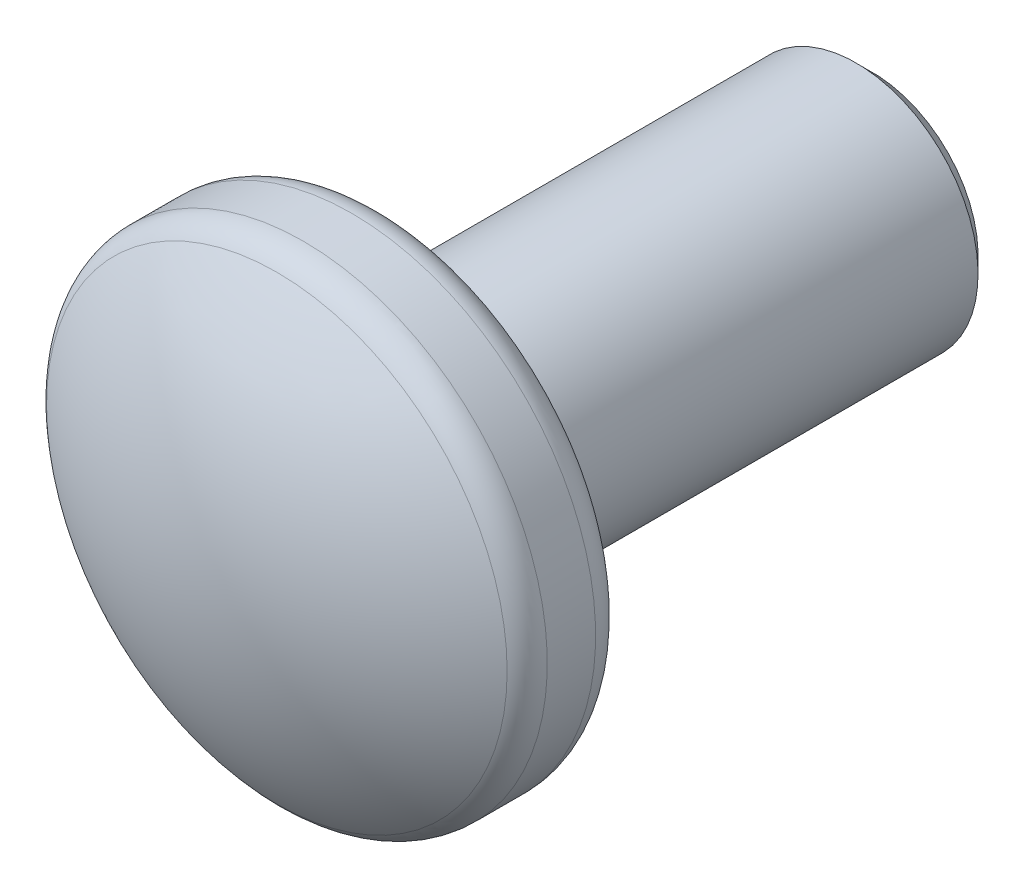
ISO-10303-21;
HEADER;
FILE_DESCRIPTION(('STEP AP214'),'2;1');
FILE_NAME('part.step','',(''),(''),'','','');
FILE_SCHEMA(('AUTOMOTIVE_DESIGN { 1 0 10303 214 1 1 1 1 }'));
ENDSEC;
DATA;
#1=APPLICATION_CONTEXT('core data for automotive mechanical design processes');
#2=APPLICATION_PROTOCOL_DEFINITION('international standard','automotive_design',2000,#1);
#3=PRODUCT_CONTEXT('',#1,'mechanical');
#4=PRODUCT('Part','Part','',(#3));
#5=PRODUCT_RELATED_PRODUCT_CATEGORY('part','',(#4));
#6=PRODUCT_DEFINITION_FORMATION('','',#4);
#7=PRODUCT_DEFINITION_CONTEXT('part definition',#1,'design');
#8=PRODUCT_DEFINITION('design','',#6,#7);
#9=PRODUCT_DEFINITION_SHAPE('','',#8);
#10=(LENGTH_UNIT() NAMED_UNIT(*) SI_UNIT(.MILLI.,.METRE.));
#11=(NAMED_UNIT(*) PLANE_ANGLE_UNIT() SI_UNIT($,.RADIAN.));
#12=(NAMED_UNIT(*) SI_UNIT($,.STERADIAN.) SOLID_ANGLE_UNIT());
#13=UNCERTAINTY_MEASURE_WITH_UNIT(LENGTH_MEASURE(1.E-05),#10,'distance_accuracy_value','');
#14=(GEOMETRIC_REPRESENTATION_CONTEXT(3) GLOBAL_UNCERTAINTY_ASSIGNED_CONTEXT((#13)) GLOBAL_UNIT_ASSIGNED_CONTEXT((#10,
#11,#12)) REPRESENTATION_CONTEXT('',''));
#15=CARTESIAN_POINT('',(0.,0.,0.));
#16=DIRECTION('',(0.,0.,1.));
#17=DIRECTION('',(1.,0.,0.));
#18=AXIS2_PLACEMENT_3D('',#15,#16,#17);
#19=CARTESIAN_POINT('',(0.,-6.92,8.));
#20=DIRECTION('',(0.,0.,-1.));
#21=DIRECTION('',(0.,1.,0.));
#22=AXIS2_PLACEMENT_3D('',#19,#20,#21);
#23=PLANE('',#22);
#24=CARTESIAN_POINT('',(0.,0.,8.));
#25=DIRECTION('',(0.,0.,1.));
#26=DIRECTION('',(0.,-1.,0.));
#27=AXIS2_PLACEMENT_3D('',#24,#25,#26);
#28=CIRCLE('',#27,4.);
#29=CARTESIAN_POINT('',(0.,-4.,8.));
#30=VERTEX_POINT('',#29);
#31=EDGE_CURVE('E58',#30,#30,#28,.T.);
#32=ORIENTED_EDGE('',*,*,#31,.T.);
#33=EDGE_LOOP('',(#32));
#34=FACE_BOUND('',#33,.T.);
#35=CARTESIAN_POINT('',(0.,0.,8.));
#36=DIRECTION('',(0.,0.,1.));
#37=DIRECTION('',(0.,-1.,0.));
#38=AXIS2_PLACEMENT_3D('',#35,#36,#37);
#39=CIRCLE('',#38,6.92);
#40=CARTESIAN_POINT('',(0.,-6.92,8.));
#41=VERTEX_POINT('',#40);
#42=EDGE_CURVE('E53',#41,#41,#39,.T.);
#43=ORIENTED_EDGE('',*,*,#42,.F.);
#44=EDGE_LOOP('',(#43));
#45=FACE_BOUND('',#44,.T.);
#46=ADVANCED_FACE('F39',(#34,#45),#23,.T.);
#47=CARTESIAN_POINT('',(0.,0.,1.16765285996055));
#48=DIRECTION('',(0.,0.,1.));
#49=DIRECTION('',(0.,1.,0.));
#50=AXIS2_PLACEMENT_3D('',#47,#48,#49);
#51=SPHERICAL_SURFACE('',#50,12.8323471400395);
#52=CARTESIAN_POINT('',(0.,0.,11.5395931373536));
#53=DIRECTION('',(0.,0.,1.));
#54=DIRECTION('',(0.,-1.,0.));
#55=AXIS2_PLACEMENT_3D('',#52,#53,#54);
#56=CIRCLE('',#55,7.55592403380751);
#57=CARTESIAN_POINT('',(0.,-7.55592403380751,11.5395931373536));
#58=VERTEX_POINT('',#57);
#59=EDGE_CURVE('E11',#58,#58,#56,.T.);
#60=ORIENTED_EDGE('',*,*,#59,.T.);
#61=EDGE_LOOP('',(#60));
#62=FACE_BOUND('',#61,.T.);
#63=ADVANCED_FACE('F85',(#62),#51,.T.);
#64=CARTESIAN_POINT('',(0.,0.,10.6666666666667));
#65=DIRECTION('',(0.,0.,1.));
#66=DIRECTION('',(0.,-1.,0.));
#67=AXIS2_PLACEMENT_3D('',#64,#65,#66);
#68=TOROIDAL_SURFACE('',#67,6.92,1.08);
#69=ORIENTED_EDGE('',*,*,#59,.F.);
#70=EDGE_LOOP('',(#69));
#71=FACE_BOUND('',#70,.T.);
#72=CARTESIAN_POINT('',(0.,0.,10.6666666666667));
#73=DIRECTION('',(0.,0.,1.));
#74=DIRECTION('',(0.,-1.,0.));
#75=AXIS2_PLACEMENT_3D('',#72,#73,#74);
#76=CIRCLE('',#75,8.);
#77=CARTESIAN_POINT('',(0.,-8.,10.6666666666667));
#78=VERTEX_POINT('',#77);
#79=EDGE_CURVE('E45',#78,#78,#76,.T.);
#80=ORIENTED_EDGE('',*,*,#79,.T.);
#81=EDGE_LOOP('',(#80));
#82=FACE_BOUND('',#81,.T.);
#83=ADVANCED_FACE('F87',(#71,#82),#68,.T.);
#84=CARTESIAN_POINT('',(0.,0.,8.));
#85=DIRECTION('',(0.,0.,1.));
#86=DIRECTION('',(0.,-1.,0.));
#87=AXIS2_PLACEMENT_3D('',#84,#85,#86);
#88=CYLINDRICAL_SURFACE('',#87,8.);
#89=ORIENTED_EDGE('',*,*,#79,.F.);
#90=EDGE_LOOP('',(#89));
#91=FACE_BOUND('',#90,.T.);
#92=CARTESIAN_POINT('',(0.,0.,9.08));
#93=DIRECTION('',(0.,0.,1.));
#94=DIRECTION('',(0.,-1.,0.));
#95=AXIS2_PLACEMENT_3D('',#92,#93,#94);
#96=CIRCLE('',#95,8.);
#97=CARTESIAN_POINT('',(0.,-8.,9.08));
#98=VERTEX_POINT('',#97);
#99=EDGE_CURVE('E49',#98,#98,#96,.T.);
#100=ORIENTED_EDGE('',*,*,#99,.T.);
#101=EDGE_LOOP('',(#100));
#102=FACE_BOUND('',#101,.T.);
#103=ADVANCED_FACE('F93',(#91,#102),#88,.T.);
#104=CARTESIAN_POINT('',(0.,0.,9.08));
#105=DIRECTION('',(0.,0.,1.));
#106=DIRECTION('',(0.,-1.,0.));
#107=AXIS2_PLACEMENT_3D('',#104,#105,#106);
#108=TOROIDAL_SURFACE('',#107,6.92,1.08);
#109=ORIENTED_EDGE('',*,*,#99,.F.);
#110=EDGE_LOOP('',(#109));
#111=FACE_BOUND('',#110,.T.);
#112=ORIENTED_EDGE('',*,*,#42,.T.);
#113=EDGE_LOOP('',(#112));
#114=FACE_BOUND('',#113,.T.);
#115=ADVANCED_FACE('F82',(#111,#114),#108,.T.);
#116=CARTESIAN_POINT('',(0.,0.,-8.));
#117=DIRECTION('',(0.,0.,1.));
#118=DIRECTION('',(0.,-1.,0.));
#119=AXIS2_PLACEMENT_3D('',#116,#117,#118);
#120=PLANE('',#119);
#121=CARTESIAN_POINT('',(0.,0.,-8.));
#122=DIRECTION('',(0.,0.,1.));
#123=DIRECTION('',(0.,-1.,0.));
#124=AXIS2_PLACEMENT_3D('',#121,#122,#123);
#125=CIRCLE('',#124,3.46666666666665);
#126=CARTESIAN_POINT('',(0.,-3.46666666666665,-8.));
#127=VERTEX_POINT('',#126);
#128=EDGE_CURVE('E59',#127,#127,#125,.F.);
#129=ORIENTED_EDGE('',*,*,#128,.T.);
#130=EDGE_LOOP('',(#129));
#131=FACE_BOUND('',#130,.T.);
#132=ADVANCED_FACE('F73',(#131),#120,.F.);
#133=CARTESIAN_POINT('',(0.,0.,8.));
#134=DIRECTION('',(0.,0.,1.));
#135=DIRECTION('',(0.,-1.,0.));
#136=AXIS2_PLACEMENT_3D('',#133,#134,#135);
#137=CYLINDRICAL_SURFACE('',#136,4.);
#138=CARTESIAN_POINT('',(0.,0.,-7.46666666666666));
#139=DIRECTION('',(0.,0.,1.));
#140=DIRECTION('',(0.,-1.,0.));
#141=AXIS2_PLACEMENT_3D('',#138,#139,#140);
#142=CIRCLE('',#141,4.);
#143=CARTESIAN_POINT('',(0.,-3.99999999999999,-7.46666666666666));
#144=VERTEX_POINT('',#143);
#145=EDGE_CURVE('E62',#144,#144,#142,.T.);
#146=ORIENTED_EDGE('',*,*,#145,.T.);
#147=EDGE_LOOP('',(#146));
#148=FACE_BOUND('',#147,.T.);
#149=ORIENTED_EDGE('',*,*,#31,.F.);
#150=EDGE_LOOP('',(#149));
#151=FACE_BOUND('',#150,.T.);
#152=ADVANCED_FACE('F70',(#148,#151),#137,.T.);
#153=CARTESIAN_POINT('',(0.,0.,-7.46666666666665));
#154=DIRECTION('',(0.,0.,1.));
#155=DIRECTION('',(0.,-1.,0.));
#156=AXIS2_PLACEMENT_3D('',#153,#154,#155);
#157=CONICAL_SURFACE('',#156,4.,0.785398163397451);
#158=CARTESIAN_POINT('',(0.,-3.46666666666665,-8.));
#159=CARTESIAN_POINT('',(0.,-3.4722222222222,-7.99444444444445));
#160=CARTESIAN_POINT('',(0.,-3.47777777777776,-7.98888888888889));
#161=CARTESIAN_POINT('',(0.,-3.48888888888887,-7.97777777777778));
#162=CARTESIAN_POINT('',(0.,-3.49444444444442,-7.97222222222222));
#163=CARTESIAN_POINT('',(0.,-3.50555555555553,-7.96111111111111));
#164=CARTESIAN_POINT('',(0.,-3.51111111111109,-7.95555555555556));
#165=CARTESIAN_POINT('',(0.,-3.5222222222222,-7.94444444444444));
#166=CARTESIAN_POINT('',(0.,-3.52777777777776,-7.93888888888889));
#167=CARTESIAN_POINT('',(0.,-3.53888888888887,-7.92777777777778));
#168=CARTESIAN_POINT('',(0.,-3.54444444444442,-7.92222222222222));
#169=CARTESIAN_POINT('',(0.,-3.55555555555554,-7.91111111111111));
#170=CARTESIAN_POINT('',(0.,-3.56111111111109,-7.90555555555556));
#171=CARTESIAN_POINT('',(0.,-3.5722222222222,-7.89444444444444));
#172=CARTESIAN_POINT('',(0.,-3.57777777777776,-7.88888888888889));
#173=CARTESIAN_POINT('',(0.,-3.58888888888887,-7.87777777777778));
#174=CARTESIAN_POINT('',(0.,-3.59444444444443,-7.87222222222222));
#175=CARTESIAN_POINT('',(0.,-3.60555555555554,-7.86111111111111));
#176=CARTESIAN_POINT('',(0.,-3.61111111111109,-7.85555555555555));
#177=CARTESIAN_POINT('',(0.,-3.6222222222222,-7.84444444444444));
#178=CARTESIAN_POINT('',(0.,-3.62777777777776,-7.83888888888889));
#179=CARTESIAN_POINT('',(0.,-3.63888888888887,-7.82777777777778));
#180=CARTESIAN_POINT('',(0.,-3.64444444444443,-7.82222222222222));
#181=CARTESIAN_POINT('',(0.,-3.65555555555554,-7.81111111111111));
#182=CARTESIAN_POINT('',(0.,-3.66111111111109,-7.80555555555555));
#183=CARTESIAN_POINT('',(0.,-3.67222222222221,-7.79444444444444));
#184=CARTESIAN_POINT('',(0.,-3.67777777777776,-7.78888888888889));
#185=CARTESIAN_POINT('',(0.,-3.68888888888887,-7.77777777777777));
#186=CARTESIAN_POINT('',(0.,-3.69444444444443,-7.77222222222222));
#187=CARTESIAN_POINT('',(0.,-3.70555555555554,-7.76111111111111));
#188=CARTESIAN_POINT('',(0.,-3.7111111111111,-7.75555555555555));
#189=CARTESIAN_POINT('',(0.,-3.72222222222221,-7.74444444444444));
#190=CARTESIAN_POINT('',(0.,-3.72777777777776,-7.73888888888888));
#191=CARTESIAN_POINT('',(0.,-3.73888888888887,-7.72777777777777));
#192=CARTESIAN_POINT('',(0.,-3.74444444444443,-7.72222222222222));
#193=CARTESIAN_POINT('',(0.,-3.75555555555554,-7.71111111111111));
#194=CARTESIAN_POINT('',(0.,-3.7611111111111,-7.70555555555555));
#195=CARTESIAN_POINT('',(0.,-3.77222222222221,-7.69444444444444));
#196=CARTESIAN_POINT('',(0.,-3.77777777777776,-7.68888888888888));
#197=CARTESIAN_POINT('',(0.,-3.78888888888887,-7.67777777777777));
#198=CARTESIAN_POINT('',(0.,-3.79444444444443,-7.67222222222222));
#199=CARTESIAN_POINT('',(0.,-3.80555555555554,-7.66111111111111));
#200=CARTESIAN_POINT('',(0.,-3.8111111111111,-7.65555555555555));
#201=CARTESIAN_POINT('',(0.,-3.82222222222221,-7.64444444444444));
#202=CARTESIAN_POINT('',(0.,-3.82777777777777,-7.63888888888888));
#203=CARTESIAN_POINT('',(0.,-3.83888888888888,-7.62777777777777));
#204=CARTESIAN_POINT('',(0.,-3.84444444444443,-7.62222222222222));
#205=CARTESIAN_POINT('',(0.,-3.85555555555554,-7.6111111111111));
#206=CARTESIAN_POINT('',(0.,-3.8611111111111,-7.60555555555555));
#207=CARTESIAN_POINT('',(0.,-3.87222222222221,-7.59444444444444));
#208=CARTESIAN_POINT('',(0.,-3.87777777777777,-7.58888888888888));
#209=CARTESIAN_POINT('',(0.,-3.88888888888888,-7.57777777777777));
#210=CARTESIAN_POINT('',(0.,-3.89444444444443,-7.57222222222221));
#211=CARTESIAN_POINT('',(0.,-3.90555555555554,-7.5611111111111));
#212=CARTESIAN_POINT('',(0.,-3.9111111111111,-7.55555555555555));
#213=CARTESIAN_POINT('',(0.,-3.92222222222221,-7.54444444444444));
#214=CARTESIAN_POINT('',(0.,-3.92777777777777,-7.53888888888888));
#215=CARTESIAN_POINT('',(0.,-3.93888888888888,-7.52777777777777));
#216=CARTESIAN_POINT('',(0.,-3.94444444444444,-7.52222222222221));
#217=CARTESIAN_POINT('',(0.,-3.95555555555555,-7.5111111111111));
#218=CARTESIAN_POINT('',(0.,-3.9611111111111,-7.50555555555555));
#219=CARTESIAN_POINT('',(0.,-3.97222222222221,-7.49444444444443));
#220=CARTESIAN_POINT('',(0.,-3.97777777777777,-7.48888888888888));
#221=CARTESIAN_POINT('',(0.,-3.98888888888888,-7.47777777777777));
#222=CARTESIAN_POINT('',(0.,-3.99444444444444,-7.47222222222221));
#223=CARTESIAN_POINT('',(0.,-3.99999999999999,-7.46666666666666));
#224=B_SPLINE_CURVE_WITH_KNOTS('',3,(#158,#159,#160,#161,#162,#163,#164,#165,#166,#167,#168,
#169,#170,#171,#172,#173,#174,#175,#176,#177,#178,#179,#180,#181,#182,#183,#184,#185,#186,#187,
#188,#189,#190,#191,#192,#193,#194,#195,#196,#197,#198,#199,#200,#201,#202,#203,#204,#205,#206,
#207,#208,#209,#210,#211,#212,#213,#214,#215,#216,#217,#218,#219,#220,#221,#222,#223),
.UNSPECIFIED.,.F.,.F.,(4,2,2,2,2,2,2,2,2,2,2,2,2,2,2,2,2,2,2,2,2,2,2,2,2,2,2,2,2,2,2,2,4),(0.,
0.023570226039553,0.0471404520791047,0.0707106781186565,0.0942809041582082,0.117851130197762,
0.141421356237313,0.164991582276865,0.188561808316418,0.21213203435597,0.235702260395522,
0.259272486435074,0.282842712474626,0.306412938514179,0.32998316455373,0.353553390593283,
0.377123616632834,0.400693842672387,0.424264068711939,0.447834294751491,0.471404520791043,
0.494974746830595,0.518544972870147,0.5421151989097,0.565685424949252,0.589255650988804,
0.612825877028356,0.636396103067908,0.65996632910746,0.683536555147013,0.707106781186565,
0.730677007226117,0.754247233265669),.UNSPECIFIED.);
#225=EDGE_CURVE('BSEAM72',#127,#144,#224,.T.);
#226=ORIENTED_EDGE('',*,*,#128,.F.);
#227=ORIENTED_EDGE('',*,*,#145,.F.);
#228=ORIENTED_EDGE('',*,*,#225,.T.);
#229=ORIENTED_EDGE('',*,*,#225,.F.);
#230=EDGE_LOOP('',(#226,#228,#227,#229));
#231=FACE_BOUND('',#230,.T.);
#232=ADVANCED_FACE('F72',(#231),#157,.T.);
#233=CLOSED_SHELL('',(#46,#63,#83,#103,#115,#132,#152,#232));
#234=MANIFOLD_SOLID_BREP('B2',#233);
#235=ADVANCED_BREP_SHAPE_REPRESENTATION('',(#18,#234),#14);
#236=SHAPE_DEFINITION_REPRESENTATION(#9,#235);
ENDSEC;
END-ISO-10303-21;
